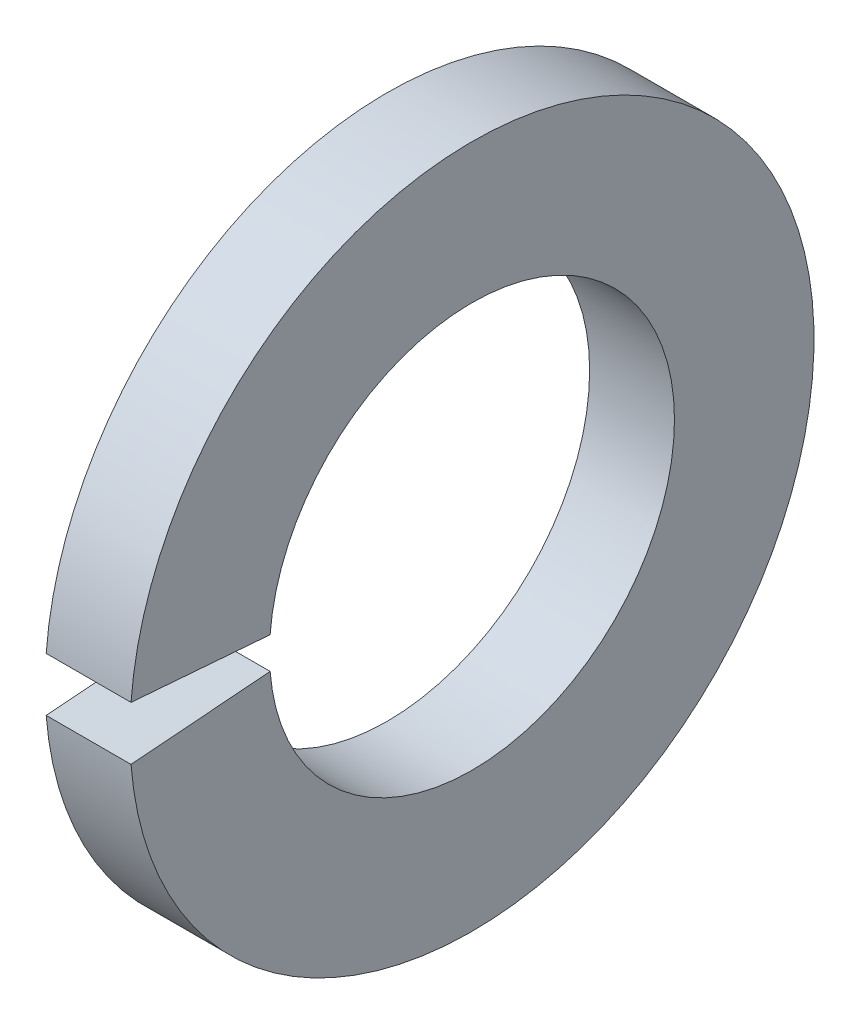
ISO-10303-21;
HEADER;
FILE_DESCRIPTION(('STEP AP214'),'2;1');
FILE_NAME('part.step','',(''),(''),'','','');
FILE_SCHEMA(('AUTOMOTIVE_DESIGN { 1 0 10303 214 1 1 1 1 }'));
ENDSEC;
DATA;
#1=APPLICATION_CONTEXT('core data for automotive mechanical design processes');
#2=APPLICATION_PROTOCOL_DEFINITION('international standard','automotive_design',2000,#1);
#3=PRODUCT_CONTEXT('',#1,'mechanical');
#4=PRODUCT('Part','Part','',(#3));
#5=PRODUCT_RELATED_PRODUCT_CATEGORY('part','',(#4));
#6=PRODUCT_DEFINITION_FORMATION('','',#4);
#7=PRODUCT_DEFINITION_CONTEXT('part definition',#1,'design');
#8=PRODUCT_DEFINITION('design','',#6,#7);
#9=PRODUCT_DEFINITION_SHAPE('','',#8);
#10=(LENGTH_UNIT() NAMED_UNIT(*) SI_UNIT(.MILLI.,.METRE.));
#11=(NAMED_UNIT(*) PLANE_ANGLE_UNIT() SI_UNIT($,.RADIAN.));
#12=(NAMED_UNIT(*) SI_UNIT($,.STERADIAN.) SOLID_ANGLE_UNIT());
#13=UNCERTAINTY_MEASURE_WITH_UNIT(LENGTH_MEASURE(1.E-05),#10,'distance_accuracy_value','');
#14=(GEOMETRIC_REPRESENTATION_CONTEXT(3) GLOBAL_UNCERTAINTY_ASSIGNED_CONTEXT((#13)) GLOBAL_UNIT_ASSIGNED_CONTEXT((#10,
#11,#12)) REPRESENTATION_CONTEXT('',''));
#15=CARTESIAN_POINT('',(0.,0.,0.));
#16=DIRECTION('',(0.,0.,1.));
#17=DIRECTION('',(1.,0.,0.));
#18=AXIS2_PLACEMENT_3D('',#15,#16,#17);
#19=CARTESIAN_POINT('',(-0.787399999999994,0.147471716330061,1.87380582048479));
#20=DIRECTION('',(-1.,0.,0.));
#21=DIRECTION('',(0.,0.,1.));
#22=AXIS2_PLACEMENT_3D('',#19,#20,#21);
#23=PLANE('',#22);
#24=CARTESIAN_POINT('',(-0.787399999999994,0.,0.));
#25=DIRECTION('',(-1.,0.,0.));
#26=DIRECTION('',(0.,0.,1.));
#27=AXIS2_PLACEMENT_3D('',#24,#25,#26);
#28=CIRCLE('',#27,3.175);
#29=CARTESIAN_POINT('',(-0.787399999999994,0.24910762893593,3.16521253460268));
#30=VERTEX_POINT('',#29);
#31=CARTESIAN_POINT('',(-0.787399999999994,-0.24910762893593,3.16521253460268));
#32=VERTEX_POINT('',#31);
#33=EDGE_CURVE('E11',#30,#32,#28,.T.);
#34=ORIENTED_EDGE('',*,*,#33,.T.);
#35=DIRECTION('',(0.,-0.0784590957278456,0.996917333733128));
#36=VECTOR('',#35,1.);
#37=CARTESIAN_POINT('',(-0.787399999999994,-0.147471716330061,1.87380582048479));
#38=LINE('',#37,#36);
#39=CARTESIAN_POINT('',(-0.787399999999994,-0.147471716330061,1.87380582048479));
#40=VERTEX_POINT('',#39);
#41=EDGE_CURVE('E72',#40,#32,#38,.T.);
#42=ORIENTED_EDGE('',*,*,#41,.F.);
#43=CARTESIAN_POINT('',(-0.787399999999994,0.,0.));
#44=DIRECTION('',(-1.,0.,0.));
#45=DIRECTION('',(0.,0.,1.));
#46=AXIS2_PLACEMENT_3D('',#43,#44,#45);
#47=CIRCLE('',#46,1.8796);
#48=CARTESIAN_POINT('',(-0.787399999999994,0.147471716330061,1.87380582048479));
#49=VERTEX_POINT('',#48);
#50=EDGE_CURVE('E47',#49,#40,#47,.T.);
#51=ORIENTED_EDGE('',*,*,#50,.F.);
#52=DIRECTION('',(0.,0.0784590957278445,0.996917333733128));
#53=VECTOR('',#52,1.);
#54=CARTESIAN_POINT('',(-0.787399999999994,0.147471716330061,1.87380582048479));
#55=LINE('',#54,#53);
#56=EDGE_CURVE('E74',#49,#30,#55,.T.);
#57=ORIENTED_EDGE('',*,*,#56,.T.);
#58=EDGE_LOOP('',(#34,#42,#51,#57));
#59=FACE_BOUND('',#58,.T.);
#60=ADVANCED_FACE('F32',(#59),#23,.T.);
#61=CARTESIAN_POINT('',(0.,0.,0.));
#62=DIRECTION('',(-1.,0.,0.));
#63=DIRECTION('',(0.,0.,1.));
#64=AXIS2_PLACEMENT_3D('',#61,#62,#63);
#65=CYLINDRICAL_SURFACE('',#64,3.175);
#66=CARTESIAN_POINT('',(0.,0.,0.));
#67=DIRECTION('',(-1.,0.,0.));
#68=DIRECTION('',(0.,0.,1.));
#69=AXIS2_PLACEMENT_3D('',#66,#67,#68);
#70=CIRCLE('',#69,3.175);
#71=CARTESIAN_POINT('',(0.,0.24910762893593,3.16521253460268));
#72=VERTEX_POINT('',#71);
#73=CARTESIAN_POINT('',(0.,-0.24910762893593,3.16521253460268));
#74=VERTEX_POINT('',#73);
#75=EDGE_CURVE('E40',#72,#74,#70,.T.);
#76=ORIENTED_EDGE('',*,*,#75,.T.);
#77=DIRECTION('',(1.,0.,0.));
#78=VECTOR('',#77,1.);
#79=CARTESIAN_POINT('',(-0.787399999999994,-0.24910762893593,3.16521253460268));
#80=LINE('',#79,#78);
#81=EDGE_CURVE('E83',#32,#74,#80,.T.);
#82=ORIENTED_EDGE('',*,*,#81,.F.);
#83=ORIENTED_EDGE('',*,*,#33,.F.);
#84=DIRECTION('',(1.,0.,0.));
#85=VECTOR('',#84,1.);
#86=CARTESIAN_POINT('',(-0.787399999999994,0.24910762893593,3.16521253460268));
#87=LINE('',#86,#85);
#88=EDGE_CURVE('E93',#30,#72,#87,.T.);
#89=ORIENTED_EDGE('',*,*,#88,.T.);
#90=EDGE_LOOP('',(#76,#82,#83,#89));
#91=FACE_BOUND('',#90,.T.);
#92=ADVANCED_FACE('F34',(#91),#65,.T.);
#93=CARTESIAN_POINT('',(0.,0.24910762893593,3.16521253460268));
#94=DIRECTION('',(1.,0.,0.));
#95=DIRECTION('',(0.,0.,-1.));
#96=AXIS2_PLACEMENT_3D('',#93,#94,#95);
#97=PLANE('',#96);
#98=CARTESIAN_POINT('',(0.,0.,0.));
#99=DIRECTION('',(-1.,0.,0.));
#100=DIRECTION('',(0.,0.,1.));
#101=AXIS2_PLACEMENT_3D('',#98,#99,#100);
#102=CIRCLE('',#101,1.8796);
#103=CARTESIAN_POINT('',(0.,0.147471716330061,1.87380582048479));
#104=VERTEX_POINT('',#103);
#105=CARTESIAN_POINT('',(0.,-0.147471716330061,1.87380582048479));
#106=VERTEX_POINT('',#105);
#107=EDGE_CURVE('E55',#104,#106,#102,.T.);
#108=ORIENTED_EDGE('',*,*,#107,.T.);
#109=DIRECTION('',(0.,0.0784590957278456,-0.996917333733128));
#110=VECTOR('',#109,1.);
#111=CARTESIAN_POINT('',(0.,-0.24910762893593,3.16521253460268));
#112=LINE('',#111,#110);
#113=EDGE_CURVE('E87',#74,#106,#112,.T.);
#114=ORIENTED_EDGE('',*,*,#113,.F.);
#115=ORIENTED_EDGE('',*,*,#75,.F.);
#116=DIRECTION('',(0.,-0.0784590957278445,-0.996917333733128));
#117=VECTOR('',#116,1.);
#118=CARTESIAN_POINT('',(0.,0.24910762893593,3.16521253460268));
#119=LINE('',#118,#117);
#120=EDGE_CURVE('E95',#72,#104,#119,.T.);
#121=ORIENTED_EDGE('',*,*,#120,.T.);
#122=EDGE_LOOP('',(#108,#114,#115,#121));
#123=FACE_BOUND('',#122,.T.);
#124=ADVANCED_FACE('F101',(#123),#97,.T.);
#125=CARTESIAN_POINT('',(0.,0.,0.));
#126=DIRECTION('',(-1.,0.,0.));
#127=DIRECTION('',(0.,0.,1.));
#128=AXIS2_PLACEMENT_3D('',#125,#126,#127);
#129=CYLINDRICAL_SURFACE('',#128,1.8796);
#130=DIRECTION('',(-1.,0.,0.));
#131=VECTOR('',#130,1.);
#132=CARTESIAN_POINT('',(0.,0.147471716330061,1.87380582048479));
#133=LINE('',#132,#131);
#134=EDGE_CURVE('E97',#104,#49,#133,.T.);
#135=ORIENTED_EDGE('',*,*,#134,.T.);
#136=ORIENTED_EDGE('',*,*,#50,.T.);
#137=DIRECTION('',(-1.,0.,0.));
#138=VECTOR('',#137,1.);
#139=CARTESIAN_POINT('',(0.,-0.147471716330061,1.87380582048479));
#140=LINE('',#139,#138);
#141=EDGE_CURVE('E85',#106,#40,#140,.T.);
#142=ORIENTED_EDGE('',*,*,#141,.F.);
#143=ORIENTED_EDGE('',*,*,#107,.F.);
#144=EDGE_LOOP('',(#135,#136,#142,#143));
#145=FACE_BOUND('',#144,.T.);
#146=ADVANCED_FACE('F104',(#145),#129,.F.);
#147=CARTESIAN_POINT('',(0.,0.,0.));
#148=DIRECTION('',(0.,0.996917333733128,-0.0784590957278445));
#149=DIRECTION('',(0.,0.0784590957278445,0.996917333733128));
#150=AXIS2_PLACEMENT_3D('',#147,#148,#149);
#151=PLANE('',#150);
#152=ORIENTED_EDGE('',*,*,#56,.F.);
#153=ORIENTED_EDGE('',*,*,#134,.F.);
#154=ORIENTED_EDGE('',*,*,#120,.F.);
#155=ORIENTED_EDGE('',*,*,#88,.F.);
#156=EDGE_LOOP('',(#152,#153,#154,#155));
#157=FACE_BOUND('',#156,.T.);
#158=ADVANCED_FACE('F106',(#157),#151,.F.);
#159=CARTESIAN_POINT('',(0.,0.,0.));
#160=DIRECTION('',(0.,0.996917333733128,0.0784590957278456));
#161=DIRECTION('',(0.,-0.0784590957278456,0.996917333733128));
#162=AXIS2_PLACEMENT_3D('',#159,#160,#161);
#163=PLANE('',#162);
#164=ORIENTED_EDGE('',*,*,#41,.T.);
#165=ORIENTED_EDGE('',*,*,#81,.T.);
#166=ORIENTED_EDGE('',*,*,#113,.T.);
#167=ORIENTED_EDGE('',*,*,#141,.T.);
#168=EDGE_LOOP('',(#164,#165,#166,#167));
#169=FACE_BOUND('',#168,.T.);
#170=ADVANCED_FACE('F81',(#169),#163,.T.);
#171=CLOSED_SHELL('',(#60,#92,#124,#146,#158,#170));
#172=MANIFOLD_SOLID_BREP('B2',#171);
#173=ADVANCED_BREP_SHAPE_REPRESENTATION('',(#18,#172),#14);
#174=SHAPE_DEFINITION_REPRESENTATION(#9,#173);
ENDSEC;
END-ISO-10303-21;
